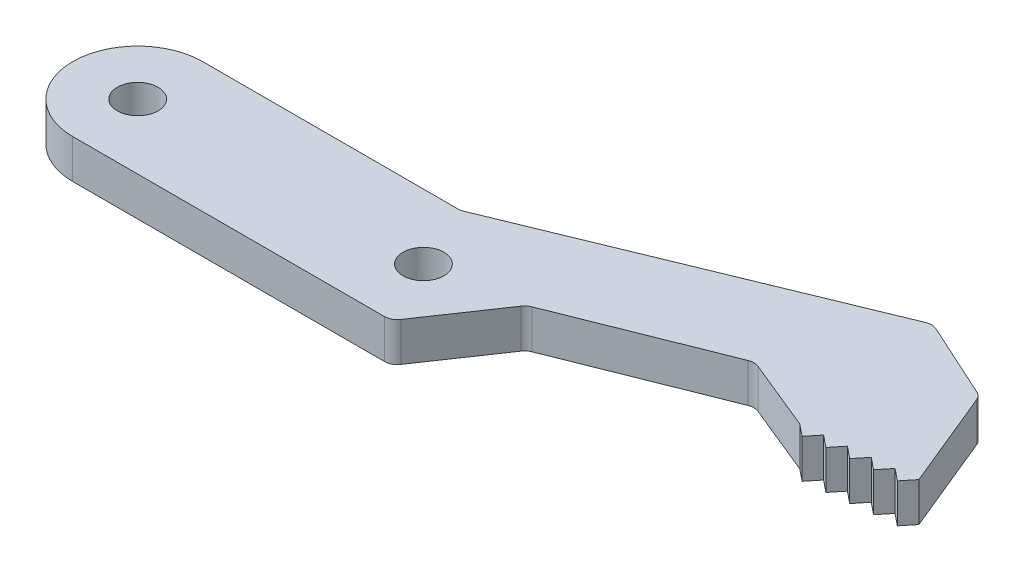
ISO-10303-21;
HEADER;
FILE_DESCRIPTION(('STEP AP214'),'2;1');
FILE_NAME('part.step','',(''),(''),'','','');
FILE_SCHEMA(('AUTOMOTIVE_DESIGN { 1 0 10303 214 1 1 1 1 }'));
ENDSEC;
DATA;
#1=APPLICATION_CONTEXT('core data for automotive mechanical design processes');
#2=APPLICATION_PROTOCOL_DEFINITION('international standard','automotive_design',2000,#1);
#3=PRODUCT_CONTEXT('',#1,'mechanical');
#4=PRODUCT('Part','Part','',(#3));
#5=PRODUCT_RELATED_PRODUCT_CATEGORY('part','',(#4));
#6=PRODUCT_DEFINITION_FORMATION('','',#4);
#7=PRODUCT_DEFINITION_CONTEXT('part definition',#1,'design');
#8=PRODUCT_DEFINITION('design','',#6,#7);
#9=PRODUCT_DEFINITION_SHAPE('','',#8);
#10=(LENGTH_UNIT() NAMED_UNIT(*) SI_UNIT(.MILLI.,.METRE.));
#11=(NAMED_UNIT(*) PLANE_ANGLE_UNIT() SI_UNIT($,.RADIAN.));
#12=(NAMED_UNIT(*) SI_UNIT($,.STERADIAN.) SOLID_ANGLE_UNIT());
#13=UNCERTAINTY_MEASURE_WITH_UNIT(LENGTH_MEASURE(1.E-05),#10,'distance_accuracy_value','');
#14=(GEOMETRIC_REPRESENTATION_CONTEXT(3) GLOBAL_UNCERTAINTY_ASSIGNED_CONTEXT((#13)) GLOBAL_UNIT_ASSIGNED_CONTEXT((#10,
#11,#12)) REPRESENTATION_CONTEXT('',''));
#15=CARTESIAN_POINT('',(0.,0.,0.));
#16=DIRECTION('',(0.,0.,1.));
#17=DIRECTION('',(1.,0.,0.));
#18=AXIS2_PLACEMENT_3D('',#15,#16,#17);
#19=CARTESIAN_POINT('',(34.139900230427,4.5,2.90640588981149));
#20=DIRECTION('',(0.,-1.,0.));
#21=DIRECTION('',(0.,0.,-1.));
#22=AXIS2_PLACEMENT_3D('',#19,#20,#21);
#23=PLANE('',#22);
#24=CARTESIAN_POINT('',(34.139900230427,4.5,2.90640588981149));
#25=DIRECTION('',(0.,-1.,0.));
#26=DIRECTION('',(0.,0.,-1.));
#27=AXIS2_PLACEMENT_3D('',#24,#25,#26);
#28=CIRCLE('',#27,2.);
#29=CARTESIAN_POINT('',(32.4843668879548,4.5,1.78426091167234));
#30=VERTEX_POINT('',#29);
#31=CARTESIAN_POINT('',(33.3991095823899,4.5,1.04865746341441));
#32=VERTEX_POINT('',#31);
#33=EDGE_CURVE('E283',#30,#32,#28,.T.);
#34=ORIENTED_EDGE('',*,*,#33,.T.);
#35=DIRECTION('',(0.92887421319854,0.,-0.370395324018532));
#36=VECTOR('',#35,1.);
#37=CARTESIAN_POINT('',(33.3991095823899,4.5,1.04865746341441));
#38=LINE('',#37,#36);
#39=CARTESIAN_POINT('',(57.2135906693667,4.5,-8.44753945238757));
#40=VERTEX_POINT('',#39);
#41=EDGE_CURVE('E146',#32,#40,#38,.T.);
#42=ORIENTED_EDGE('',*,*,#41,.T.);
#43=CARTESIAN_POINT('',(57.9543813174038,4.5,-6.58979102599049));
#44=DIRECTION('',(0.,-1.,0.));
#45=DIRECTION('',(0.,0.,-1.));
#46=AXIS2_PLACEMENT_3D('',#43,#44,#45);
#47=CIRCLE('',#46,2.);
#48=CARTESIAN_POINT('',(58.7120016151558,4.5,-8.4407398325311));
#49=VERTEX_POINT('',#48);
#50=EDGE_CURVE('E349',#40,#49,#47,.T.);
#51=ORIENTED_EDGE('',*,*,#50,.T.);
#52=DIRECTION('',(0.925474403270305,0.,0.378810148876022));
#53=VECTOR('',#52,1.);
#54=CARTESIAN_POINT('',(58.7120016151558,4.5,-8.4407398325311));
#55=LINE('',#54,#53);
#56=CARTESIAN_POINT('',(69.6436567239064,4.5,-3.96625422323257));
#57=VERTEX_POINT('',#56);
#58=EDGE_CURVE('E368',#49,#57,#55,.T.);
#59=ORIENTED_EDGE('',*,*,#58,.T.);
#60=DIRECTION('',(0.777249081254573,0.,0.629193027368329));
#61=VECTOR('',#60,1.);
#62=CARTESIAN_POINT('',(69.6436567239064,4.5,-3.96625422323257));
#63=LINE('',#62,#61);
#64=CARTESIAN_POINT('',(71.4779645556672,4.5,-2.48135867864334));
#65=VERTEX_POINT('',#64);
#66=EDGE_CURVE('E365',#57,#65,#63,.T.);
#67=ORIENTED_EDGE('',*,*,#66,.T.);
#68=DIRECTION('',(0.629193027368274,0.,-0.777249081254617));
#69=VECTOR('',#68,1.);
#70=CARTESIAN_POINT('',(71.4779645556672,4.5,-2.48135867864334));
#71=LINE('',#70,#69);
#72=CARTESIAN_POINT('',(72.9628601002563,4.5,-4.31566651040423));
#73=VERTEX_POINT('',#72);
#74=EDGE_CURVE('E367',#65,#73,#71,.T.);
#75=ORIENTED_EDGE('',*,*,#74,.T.);
#76=DIRECTION('',(0.777249081254579,0.,0.62919302736832));
#77=VECTOR('',#76,1.);
#78=CARTESIAN_POINT('',(72.9628601002563,4.5,-4.31566651040423));
#79=LINE('',#78,#77);
#80=CARTESIAN_POINT('',(74.7971679320171,4.5,-2.83077096581498));
#81=VERTEX_POINT('',#80);
#82=EDGE_CURVE('E370',#73,#81,#79,.T.);
#83=ORIENTED_EDGE('',*,*,#82,.T.);
#84=DIRECTION('',(0.629193027368325,0.,-0.777249081254575));
#85=VECTOR('',#84,1.);
#86=CARTESIAN_POINT('',(74.7971679320171,4.5,-2.83077096581498));
#87=LINE('',#86,#85);
#88=CARTESIAN_POINT('',(76.2820634766064,4.5,-4.66507879757578));
#89=VERTEX_POINT('',#88);
#90=EDGE_CURVE('E376',#81,#89,#87,.T.);
#91=ORIENTED_EDGE('',*,*,#90,.T.);
#92=DIRECTION('',(0.777249081254577,0.,0.629193027368323));
#93=VECTOR('',#92,1.);
#94=CARTESIAN_POINT('',(76.2820634766064,4.5,-4.66507879757578));
#95=LINE('',#94,#93);
#96=CARTESIAN_POINT('',(78.1163713083671,4.5,-3.18018325298653));
#97=VERTEX_POINT('',#96);
#98=EDGE_CURVE('E378',#89,#97,#95,.T.);
#99=ORIENTED_EDGE('',*,*,#98,.T.);
#100=DIRECTION('',(0.629193027368326,0.,-0.777249081254575));
#101=VECTOR('',#100,1.);
#102=CARTESIAN_POINT('',(78.1163713083671,4.5,-3.18018325298653));
#103=LINE('',#102,#101);
#104=CARTESIAN_POINT('',(79.6012668529564,4.5,-5.01449108474733));
#105=VERTEX_POINT('',#104);
#106=EDGE_CURVE('E380',#97,#105,#103,.T.);
#107=ORIENTED_EDGE('',*,*,#106,.T.);
#108=DIRECTION('',(0.777249081254583,0.,0.629193027368317));
#109=VECTOR('',#108,1.);
#110=CARTESIAN_POINT('',(79.6012668529564,4.5,-5.01449108474733));
#111=LINE('',#110,#109);
#112=CARTESIAN_POINT('',(81.4355746847172,4.5,-3.5295955401581));
#113=VERTEX_POINT('',#112);
#114=EDGE_CURVE('E382',#105,#113,#111,.T.);
#115=ORIENTED_EDGE('',*,*,#114,.T.);
#116=DIRECTION('',(0.629193027368326,0.,-0.777249081254575));
#117=VECTOR('',#116,1.);
#118=CARTESIAN_POINT('',(81.4355746847172,4.5,-3.5295955401581));
#119=LINE('',#118,#117);
#120=CARTESIAN_POINT('',(82.9204702293065,4.5,-5.3639033719189));
#121=VERTEX_POINT('',#120);
#122=EDGE_CURVE('E384',#113,#121,#119,.T.);
#123=ORIENTED_EDGE('',*,*,#122,.T.);
#124=DIRECTION('',(0.777249081254587,0.,0.629193027368311));
#125=VECTOR('',#124,1.);
#126=CARTESIAN_POINT('',(82.9204702293065,4.5,-5.3639033719189));
#127=LINE('',#126,#125);
#128=CARTESIAN_POINT('',(84.7547780610673,4.5,-3.87900782732968));
#129=VERTEX_POINT('',#128);
#130=EDGE_CURVE('E386',#121,#129,#127,.T.);
#131=ORIENTED_EDGE('',*,*,#130,.T.);
#132=DIRECTION('',(0.629193027368273,0.,-0.777249081254618));
#133=VECTOR('',#132,1.);
#134=CARTESIAN_POINT('',(84.7547780610673,4.5,-3.87900782732968));
#135=LINE('',#134,#133);
#136=CARTESIAN_POINT('',(86.2396736056564,4.5,-5.71331565909054));
#137=VERTEX_POINT('',#136);
#138=EDGE_CURVE('E388',#129,#137,#135,.T.);
#139=ORIENTED_EDGE('',*,*,#138,.T.);
#140=DIRECTION('',(-0.380263412733204,0.,-0.92487822816655));
#141=VECTOR('',#140,1.);
#142=CARTESIAN_POINT('',(80.0379760726159,4.5,-20.7971097710621));
#143=LINE('',#142,#141);
#144=CARTESIAN_POINT('',(80.0379760726159,4.5,-20.7971097710621));
#145=VERTEX_POINT('',#144);
#146=EDGE_CURVE('E390',#137,#145,#143,.T.);
#147=ORIENTED_EDGE('',*,*,#146,.T.);
#148=CARTESIAN_POINT('',(78.1882196162828,4.5,-20.0365829455957));
#149=DIRECTION('',(0.,1.,0.));
#150=DIRECTION('',(0.,0.,-1.));
#151=AXIS2_PLACEMENT_3D('',#148,#149,#150);
#152=CIRCLE('',#151,2.);
#153=CARTESIAN_POINT('',(79.0172884525598,4.5,-21.8566502148785));
#154=VERTEX_POINT('',#153);
#155=EDGE_CURVE('E392',#145,#154,#152,.T.);
#156=ORIENTED_EDGE('',*,*,#155,.T.);
#157=DIRECTION('',(-0.910033634641374,0.,-0.414534418138482));
#158=VECTOR('',#157,1.);
#159=CARTESIAN_POINT('',(67.4028520849976,4.5,-27.1472059024506));
#160=LINE('',#159,#158);
#161=CARTESIAN_POINT('',(67.4028520849976,4.5,-27.1472059024506));
#162=VERTEX_POINT('',#161);
#163=EDGE_CURVE('E394',#154,#162,#160,.T.);
#164=ORIENTED_EDGE('',*,*,#163,.T.);
#165=CARTESIAN_POINT('',(66.5737832487207,4.5,-25.3271386331678));
#166=DIRECTION('',(0.,1.,0.));
#167=DIRECTION('',(0.,0.,-1.));
#168=AXIS2_PLACEMENT_3D('',#165,#166,#167);
#169=CIRCLE('',#168,2.);
#170=CARTESIAN_POINT('',(65.8132564232542,4.5,-27.1768950895009));
#171=VERTEX_POINT('',#170);
#172=EDGE_CURVE('E396',#162,#171,#169,.T.);
#173=ORIENTED_EDGE('',*,*,#172,.T.);
#174=DIRECTION('',(-0.924878228166549,0.,0.380263412733207));
#175=VECTOR('',#174,1.);
#176=CARTESIAN_POINT('',(15.4199071979664,4.5,-6.45768430923213));
#177=LINE('',#176,#175);
#178=CARTESIAN_POINT('',(15.4199071979664,4.5,-6.45768430923213));
#179=VERTEX_POINT('',#178);
#180=EDGE_CURVE('E398',#171,#179,#177,.T.);
#181=ORIENTED_EDGE('',*,*,#180,.T.);
#182=CARTESIAN_POINT('',(14.6593803725,4.5,-8.30744076556523));
#183=DIRECTION('',(0.,-1.,0.));
#184=DIRECTION('',(0.,0.,1.));
#185=AXIS2_PLACEMENT_3D('',#182,#183,#184);
#186=CIRCLE('',#185,2.);
#187=CARTESIAN_POINT('',(14.6593803725,4.5,-6.30744076556523));
#188=VERTEX_POINT('',#187);
#189=EDGE_CURVE('E400',#179,#188,#186,.T.);
#190=ORIENTED_EDGE('',*,*,#189,.T.);
#191=DIRECTION('',(-1.,0.,0.));
#192=VECTOR('',#191,1.);
#193=CARTESIAN_POINT('',(-24.64551576361,4.5,-6.30744076556523));
#194=LINE('',#193,#192);
#195=CARTESIAN_POINT('',(-24.64551576361,4.5,-6.30744076556523));
#196=VERTEX_POINT('',#195);
#197=EDGE_CURVE('E402',#188,#196,#194,.T.);
#198=ORIENTED_EDGE('',*,*,#197,.T.);
#199=CARTESIAN_POINT('',(-24.64551576361,4.5,3.69255923443477));
#200=DIRECTION('',(0.,1.,0.));
#201=DIRECTION('',(0.,0.,1.));
#202=AXIS2_PLACEMENT_3D('',#199,#200,#201);
#203=CIRCLE('',#202,10.);
#204=CARTESIAN_POINT('',(-24.64551576361,4.5,13.6925592344348));
#205=VERTEX_POINT('',#204);
#206=EDGE_CURVE('E216',#196,#205,#203,.T.);
#207=ORIENTED_EDGE('',*,*,#206,.T.);
#208=DIRECTION('',(1.,0.,0.));
#209=VECTOR('',#208,1.);
#210=CARTESIAN_POINT('',(-24.64551576361,4.5,13.6925592344348));
#211=LINE('',#210,#209);
#212=CARTESIAN_POINT('',(23.352235980693,4.5,13.6925592344348));
#213=VERTEX_POINT('',#212);
#214=EDGE_CURVE('E210',#205,#213,#211,.T.);
#215=ORIENTED_EDGE('',*,*,#214,.T.);
#216=CARTESIAN_POINT('',(23.352235980693,4.5,11.6925592344348));
#217=DIRECTION('',(0.,1.,0.));
#218=DIRECTION('',(0.,0.,1.));
#219=AXIS2_PLACEMENT_3D('',#216,#217,#218);
#220=CIRCLE('',#219,2.);
#221=CARTESIAN_POINT('',(25.0077693231652,4.5,12.8147042125739));
#222=VERTEX_POINT('',#221);
#223=EDGE_CURVE('E214',#213,#222,#220,.T.);
#224=ORIENTED_EDGE('',*,*,#223,.T.);
#225=DIRECTION('',(0.561072489069578,0.,-0.827766671236085));
#226=VECTOR('',#225,1.);
#227=CARTESIAN_POINT('',(25.0077693231652,4.5,12.8147042125739));
#228=LINE('',#227,#226);
#229=EDGE_CURVE('E52',#222,#30,#228,.T.);
#230=ORIENTED_EDGE('',*,*,#229,.T.);
#231=EDGE_LOOP('',(#34,#42,#51,#59,#67,#75,#83,#91,#99,#107,#115,#123,#131,#139,#147,#156,#164,
#173,#181,#190,#198,#207,#215,#224,#230));
#232=FACE_BOUND('',#231,.T.);
#233=CARTESIAN_POINT('',(-24.64551576361,4.5,3.69255923443477));
#234=DIRECTION('',(0.,1.,0.));
#235=DIRECTION('',(0.,0.,1.));
#236=AXIS2_PLACEMENT_3D('',#233,#234,#235);
#237=CIRCLE('',#236,3.15);
#238=CARTESIAN_POINT('',(-24.64551576361,4.5,6.84255923443477));
#239=VERTEX_POINT('',#238);
#240=EDGE_CURVE('E238',#239,#239,#237,.T.);
#241=ORIENTED_EDGE('',*,*,#240,.F.);
#242=EDGE_LOOP('',(#241));
#243=FACE_BOUND('',#242,.T.);
#244=CARTESIAN_POINT('',(19.35448423639,4.5,3.69255923443477));
#245=DIRECTION('',(0.,1.,0.));
#246=DIRECTION('',(0.,0.,1.));
#247=AXIS2_PLACEMENT_3D('',#244,#245,#246);
#248=CIRCLE('',#247,3.15);
#249=CARTESIAN_POINT('',(19.35448423639,4.5,6.84255923443477));
#250=VERTEX_POINT('',#249);
#251=EDGE_CURVE('E443',#250,#250,#248,.T.);
#252=ORIENTED_EDGE('',*,*,#251,.F.);
#253=EDGE_LOOP('',(#252));
#254=FACE_BOUND('',#253,.T.);
#255=ADVANCED_FACE('F35',(#232,#243,#254),#23,.F.);
#256=CARTESIAN_POINT('',(34.139900230427,-1.5,2.90640588981149));
#257=DIRECTION('',(0.,-1.,0.));
#258=DIRECTION('',(0.,0.,-1.));
#259=AXIS2_PLACEMENT_3D('',#256,#257,#258);
#260=PLANE('',#259);
#261=CARTESIAN_POINT('',(-24.64551576361,-1.5,3.69255923443477));
#262=DIRECTION('',(0.,1.,0.));
#263=DIRECTION('',(0.,0.,1.));
#264=AXIS2_PLACEMENT_3D('',#261,#262,#263);
#265=CIRCLE('',#264,3.15);
#266=CARTESIAN_POINT('',(-24.64551576361,-1.5,6.84255923443477));
#267=VERTEX_POINT('',#266);
#268=EDGE_CURVE('E448',#267,#267,#265,.T.);
#269=ORIENTED_EDGE('',*,*,#268,.T.);
#270=EDGE_LOOP('',(#269));
#271=FACE_BOUND('',#270,.T.);
#272=CARTESIAN_POINT('',(34.139900230427,-1.5,2.90640588981149));
#273=DIRECTION('',(0.,-1.,0.));
#274=DIRECTION('',(0.,0.,-1.));
#275=AXIS2_PLACEMENT_3D('',#272,#273,#274);
#276=CIRCLE('',#275,2.);
#277=CARTESIAN_POINT('',(32.4843668879548,-1.5,1.78426091167234));
#278=VERTEX_POINT('',#277);
#279=CARTESIAN_POINT('',(33.3991095823899,-1.5,1.04865746341441));
#280=VERTEX_POINT('',#279);
#281=EDGE_CURVE('E234',#278,#280,#276,.T.);
#282=ORIENTED_EDGE('',*,*,#281,.F.);
#283=DIRECTION('',(0.561072489069578,0.,-0.827766671236085));
#284=VECTOR('',#283,1.);
#285=CARTESIAN_POINT('',(25.0077693231652,-1.5,12.8147042125739));
#286=LINE('',#285,#284);
#287=CARTESIAN_POINT('',(25.0077693231652,-1.5,12.8147042125739));
#288=VERTEX_POINT('',#287);
#289=EDGE_CURVE('E138',#288,#278,#286,.T.);
#290=ORIENTED_EDGE('',*,*,#289,.F.);
#291=CARTESIAN_POINT('',(23.352235980693,-1.5,11.6925592344348));
#292=DIRECTION('',(0.,1.,0.));
#293=DIRECTION('',(0.,0.,1.));
#294=AXIS2_PLACEMENT_3D('',#291,#292,#293);
#295=CIRCLE('',#294,2.);
#296=CARTESIAN_POINT('',(23.352235980693,-1.5,13.6925592344348));
#297=VERTEX_POINT('',#296);
#298=EDGE_CURVE('E132',#297,#288,#295,.T.);
#299=ORIENTED_EDGE('',*,*,#298,.F.);
#300=DIRECTION('',(1.,0.,0.));
#301=VECTOR('',#300,1.);
#302=CARTESIAN_POINT('',(-24.64551576361,-1.5,13.6925592344348));
#303=LINE('',#302,#301);
#304=CARTESIAN_POINT('',(-24.64551576361,-1.5,13.6925592344348));
#305=VERTEX_POINT('',#304);
#306=EDGE_CURVE('E224',#305,#297,#303,.T.);
#307=ORIENTED_EDGE('',*,*,#306,.F.);
#308=CARTESIAN_POINT('',(-24.64551576361,-1.5,3.69255923443477));
#309=DIRECTION('',(0.,1.,0.));
#310=DIRECTION('',(0.,0.,1.));
#311=AXIS2_PLACEMENT_3D('',#308,#309,#310);
#312=CIRCLE('',#311,10.);
#313=CARTESIAN_POINT('',(-24.64551576361,-1.5,-6.30744076556523));
#314=VERTEX_POINT('',#313);
#315=EDGE_CURVE('E278',#314,#305,#312,.T.);
#316=ORIENTED_EDGE('',*,*,#315,.F.);
#317=DIRECTION('',(-1.,0.,0.));
#318=VECTOR('',#317,1.);
#319=CARTESIAN_POINT('',(-24.64551576361,-1.5,-6.30744076556523));
#320=LINE('',#319,#318);
#321=CARTESIAN_POINT('',(14.6593803725,-1.5,-6.30744076556523));
#322=VERTEX_POINT('',#321);
#323=EDGE_CURVE('E276',#322,#314,#320,.T.);
#324=ORIENTED_EDGE('',*,*,#323,.F.);
#325=CARTESIAN_POINT('',(14.6593803725,-1.5,-8.30744076556523));
#326=DIRECTION('',(0.,-1.,0.));
#327=DIRECTION('',(0.,0.,1.));
#328=AXIS2_PLACEMENT_3D('',#325,#326,#327);
#329=CIRCLE('',#328,2.);
#330=CARTESIAN_POINT('',(15.4199071979664,-1.5,-6.45768430923213));
#331=VERTEX_POINT('',#330);
#332=EDGE_CURVE('E274',#331,#322,#329,.T.);
#333=ORIENTED_EDGE('',*,*,#332,.F.);
#334=DIRECTION('',(-0.924878228166549,0.,0.380263412733207));
#335=VECTOR('',#334,1.);
#336=CARTESIAN_POINT('',(15.4199071979664,-1.5,-6.45768430923213));
#337=LINE('',#336,#335);
#338=CARTESIAN_POINT('',(65.8132564232542,-1.5,-27.1768950895009));
#339=VERTEX_POINT('',#338);
#340=EDGE_CURVE('E272',#339,#331,#337,.T.);
#341=ORIENTED_EDGE('',*,*,#340,.F.);
#342=CARTESIAN_POINT('',(66.5737832487207,-1.5,-25.3271386331678));
#343=DIRECTION('',(0.,1.,0.));
#344=DIRECTION('',(0.,0.,-1.));
#345=AXIS2_PLACEMENT_3D('',#342,#343,#344);
#346=CIRCLE('',#345,2.);
#347=CARTESIAN_POINT('',(67.4028520849976,-1.5,-27.1472059024506));
#348=VERTEX_POINT('',#347);
#349=EDGE_CURVE('E270',#348,#339,#346,.T.);
#350=ORIENTED_EDGE('',*,*,#349,.F.);
#351=DIRECTION('',(-0.910033634641374,0.,-0.414534418138482));
#352=VECTOR('',#351,1.);
#353=CARTESIAN_POINT('',(67.4028520849976,-1.5,-27.1472059024506));
#354=LINE('',#353,#352);
#355=CARTESIAN_POINT('',(79.0172884525598,-1.5,-21.8566502148785));
#356=VERTEX_POINT('',#355);
#357=EDGE_CURVE('E268',#356,#348,#354,.T.);
#358=ORIENTED_EDGE('',*,*,#357,.F.);
#359=CARTESIAN_POINT('',(78.1882196162828,-1.5,-20.0365829455957));
#360=DIRECTION('',(0.,1.,0.));
#361=DIRECTION('',(0.,0.,-1.));
#362=AXIS2_PLACEMENT_3D('',#359,#360,#361);
#363=CIRCLE('',#362,2.);
#364=CARTESIAN_POINT('',(80.0379760726159,-1.5,-20.7971097710621));
#365=VERTEX_POINT('',#364);
#366=EDGE_CURVE('E266',#365,#356,#363,.T.);
#367=ORIENTED_EDGE('',*,*,#366,.F.);
#368=DIRECTION('',(-0.380263412733204,0.,-0.92487822816655));
#369=VECTOR('',#368,1.);
#370=CARTESIAN_POINT('',(80.0379760726159,-1.5,-20.7971097710621));
#371=LINE('',#370,#369);
#372=CARTESIAN_POINT('',(86.2396736056564,-1.5,-5.71331565909054));
#373=VERTEX_POINT('',#372);
#374=EDGE_CURVE('E264',#373,#365,#371,.T.);
#375=ORIENTED_EDGE('',*,*,#374,.F.);
#376=DIRECTION('',(0.629193027368273,0.,-0.777249081254618));
#377=VECTOR('',#376,1.);
#378=CARTESIAN_POINT('',(84.7547780610673,-1.5,-3.87900782732968));
#379=LINE('',#378,#377);
#380=CARTESIAN_POINT('',(84.7547780610673,-1.5,-3.87900782732968));
#381=VERTEX_POINT('',#380);
#382=EDGE_CURVE('E262',#381,#373,#379,.T.);
#383=ORIENTED_EDGE('',*,*,#382,.F.);
#384=DIRECTION('',(0.777249081254587,0.,0.629193027368311));
#385=VECTOR('',#384,1.);
#386=CARTESIAN_POINT('',(82.9204702293065,-1.5,-5.3639033719189));
#387=LINE('',#386,#385);
#388=CARTESIAN_POINT('',(82.9204702293065,-1.5,-5.3639033719189));
#389=VERTEX_POINT('',#388);
#390=EDGE_CURVE('E260',#389,#381,#387,.T.);
#391=ORIENTED_EDGE('',*,*,#390,.F.);
#392=DIRECTION('',(0.629193027368326,0.,-0.777249081254575));
#393=VECTOR('',#392,1.);
#394=CARTESIAN_POINT('',(81.4355746847172,-1.5,-3.5295955401581));
#395=LINE('',#394,#393);
#396=CARTESIAN_POINT('',(81.4355746847172,-1.5,-3.5295955401581));
#397=VERTEX_POINT('',#396);
#398=EDGE_CURVE('E258',#397,#389,#395,.T.);
#399=ORIENTED_EDGE('',*,*,#398,.F.);
#400=DIRECTION('',(0.777249081254583,0.,0.629193027368317));
#401=VECTOR('',#400,1.);
#402=CARTESIAN_POINT('',(79.6012668529564,-1.5,-5.01449108474733));
#403=LINE('',#402,#401);
#404=CARTESIAN_POINT('',(79.6012668529564,-1.5,-5.01449108474733));
#405=VERTEX_POINT('',#404);
#406=EDGE_CURVE('E256',#405,#397,#403,.T.);
#407=ORIENTED_EDGE('',*,*,#406,.F.);
#408=DIRECTION('',(0.629193027368326,0.,-0.777249081254575));
#409=VECTOR('',#408,1.);
#410=CARTESIAN_POINT('',(78.1163713083671,-1.5,-3.18018325298653));
#411=LINE('',#410,#409);
#412=CARTESIAN_POINT('',(78.1163713083671,-1.5,-3.18018325298653));
#413=VERTEX_POINT('',#412);
#414=EDGE_CURVE('E254',#413,#405,#411,.T.);
#415=ORIENTED_EDGE('',*,*,#414,.F.);
#416=DIRECTION('',(0.777249081254577,0.,0.629193027368323));
#417=VECTOR('',#416,1.);
#418=CARTESIAN_POINT('',(76.2820634766064,-1.5,-4.66507879757578));
#419=LINE('',#418,#417);
#420=CARTESIAN_POINT('',(76.2820634766064,-1.5,-4.66507879757578));
#421=VERTEX_POINT('',#420);
#422=EDGE_CURVE('E252',#421,#413,#419,.T.);
#423=ORIENTED_EDGE('',*,*,#422,.F.);
#424=DIRECTION('',(0.629193027368325,0.,-0.777249081254575));
#425=VECTOR('',#424,1.);
#426=CARTESIAN_POINT('',(74.7971679320171,-1.5,-2.83077096581498));
#427=LINE('',#426,#425);
#428=CARTESIAN_POINT('',(74.7971679320171,-1.5,-2.83077096581498));
#429=VERTEX_POINT('',#428);
#430=EDGE_CURVE('E250',#429,#421,#427,.T.);
#431=ORIENTED_EDGE('',*,*,#430,.F.);
#432=DIRECTION('',(0.777249081254579,0.,0.62919302736832));
#433=VECTOR('',#432,1.);
#434=CARTESIAN_POINT('',(72.9628601002563,-1.5,-4.31566651040423));
#435=LINE('',#434,#433);
#436=CARTESIAN_POINT('',(72.9628601002563,-1.5,-4.31566651040423));
#437=VERTEX_POINT('',#436);
#438=EDGE_CURVE('E248',#437,#429,#435,.T.);
#439=ORIENTED_EDGE('',*,*,#438,.F.);
#440=DIRECTION('',(0.629193027368274,0.,-0.777249081254617));
#441=VECTOR('',#440,1.);
#442=CARTESIAN_POINT('',(71.4779645556672,-1.5,-2.48135867864334));
#443=LINE('',#442,#441);
#444=CARTESIAN_POINT('',(71.4779645556672,-1.5,-2.48135867864334));
#445=VERTEX_POINT('',#444);
#446=EDGE_CURVE('E246',#445,#437,#443,.T.);
#447=ORIENTED_EDGE('',*,*,#446,.F.);
#448=DIRECTION('',(0.777249081254573,0.,0.629193027368329));
#449=VECTOR('',#448,1.);
#450=CARTESIAN_POINT('',(69.6436567239064,-1.5,-3.96625422323257));
#451=LINE('',#450,#449);
#452=CARTESIAN_POINT('',(69.6436567239064,-1.5,-3.96625422323257));
#453=VERTEX_POINT('',#452);
#454=EDGE_CURVE('E244',#453,#445,#451,.T.);
#455=ORIENTED_EDGE('',*,*,#454,.F.);
#456=DIRECTION('',(0.925474403270305,0.,0.378810148876022));
#457=VECTOR('',#456,1.);
#458=CARTESIAN_POINT('',(58.7120016151558,-1.5,-8.4407398325311));
#459=LINE('',#458,#457);
#460=CARTESIAN_POINT('',(58.7120016151558,-1.5,-8.4407398325311));
#461=VERTEX_POINT('',#460);
#462=EDGE_CURVE('E242',#461,#453,#459,.T.);
#463=ORIENTED_EDGE('',*,*,#462,.F.);
#464=CARTESIAN_POINT('',(57.9543813174038,-1.5,-6.58979102599049));
#465=DIRECTION('',(0.,-1.,0.));
#466=DIRECTION('',(0.,0.,-1.));
#467=AXIS2_PLACEMENT_3D('',#464,#465,#466);
#468=CIRCLE('',#467,2.);
#469=CARTESIAN_POINT('',(57.2135906693667,-1.5,-8.44753945238757));
#470=VERTEX_POINT('',#469);
#471=EDGE_CURVE('E240',#470,#461,#468,.T.);
#472=ORIENTED_EDGE('',*,*,#471,.F.);
#473=DIRECTION('',(0.92887421319854,0.,-0.370395324018532));
#474=VECTOR('',#473,1.);
#475=CARTESIAN_POINT('',(33.3991095823899,-1.5,1.04865746341441));
#476=LINE('',#475,#474);
#477=EDGE_CURVE('E237',#280,#470,#476,.T.);
#478=ORIENTED_EDGE('',*,*,#477,.F.);
#479=EDGE_LOOP('',(#282,#290,#299,#307,#316,#324,#333,#341,#350,#358,#367,#375,#383,#391,#399,
#407,#415,#423,#431,#439,#447,#455,#463,#472,#478));
#480=FACE_BOUND('',#479,.T.);
#481=CARTESIAN_POINT('',(19.35448423639,-1.5,3.69255923443477));
#482=DIRECTION('',(0.,1.,0.));
#483=DIRECTION('',(0.,0.,1.));
#484=AXIS2_PLACEMENT_3D('',#481,#482,#483);
#485=CIRCLE('',#484,3.15);
#486=CARTESIAN_POINT('',(19.35448423639,-1.5,6.84255923443477));
#487=VERTEX_POINT('',#486);
#488=EDGE_CURVE('E446',#487,#487,#485,.T.);
#489=ORIENTED_EDGE('',*,*,#488,.T.);
#490=EDGE_LOOP('',(#489));
#491=FACE_BOUND('',#490,.T.);
#492=ADVANCED_FACE('F353',(#271,#480,#491),#260,.T.);
#493=CARTESIAN_POINT('',(34.139900230427,4.5,2.90640588981149));
#494=DIRECTION('',(0.,-1.,0.));
#495=DIRECTION('',(0.,0.,-1.));
#496=AXIS2_PLACEMENT_3D('',#493,#494,#495);
#497=CYLINDRICAL_SURFACE('',#496,2.);
#498=ORIENTED_EDGE('',*,*,#281,.T.);
#499=DIRECTION('',(0.,-1.,0.));
#500=VECTOR('',#499,1.);
#501=CARTESIAN_POINT('',(33.3991095823899,4.5,1.04865746341441));
#502=LINE('',#501,#500);
#503=EDGE_CURVE('E11',#32,#280,#502,.T.);
#504=ORIENTED_EDGE('',*,*,#503,.F.);
#505=ORIENTED_EDGE('',*,*,#33,.F.);
#506=DIRECTION('',(0.,-1.,0.));
#507=VECTOR('',#506,1.);
#508=CARTESIAN_POINT('',(32.4843668879548,4.5,1.78426091167234));
#509=LINE('',#508,#507);
#510=EDGE_CURVE('E230',#30,#278,#509,.T.);
#511=ORIENTED_EDGE('',*,*,#510,.T.);
#512=EDGE_LOOP('',(#498,#504,#505,#511));
#513=FACE_BOUND('',#512,.T.);
#514=ADVANCED_FACE('F37',(#513),#497,.F.);
#515=CARTESIAN_POINT('',(33.3991095823899,4.5,1.04865746341441));
#516=DIRECTION('',(-0.370395324018532,0.,-0.92887421319854));
#517=DIRECTION('',(-0.92887421319854,0.,0.370395324018532));
#518=AXIS2_PLACEMENT_3D('',#515,#516,#517);
#519=PLANE('',#518);
#520=ORIENTED_EDGE('',*,*,#477,.T.);
#521=DIRECTION('',(0.,-1.,0.));
#522=VECTOR('',#521,1.);
#523=CARTESIAN_POINT('',(57.2135906693667,4.5,-8.44753945238757));
#524=LINE('',#523,#522);
#525=EDGE_CURVE('E44',#40,#470,#524,.T.);
#526=ORIENTED_EDGE('',*,*,#525,.F.);
#527=ORIENTED_EDGE('',*,*,#41,.F.);
#528=ORIENTED_EDGE('',*,*,#503,.T.);
#529=EDGE_LOOP('',(#520,#526,#527,#528));
#530=FACE_BOUND('',#529,.T.);
#531=ADVANCED_FACE('F673',(#530),#519,.F.);
#532=CARTESIAN_POINT('',(57.9543813174038,4.5,-6.58979102599049));
#533=DIRECTION('',(0.,-1.,0.));
#534=DIRECTION('',(0.,0.,-1.));
#535=AXIS2_PLACEMENT_3D('',#532,#533,#534);
#536=CYLINDRICAL_SURFACE('',#535,2.);
#537=ORIENTED_EDGE('',*,*,#471,.T.);
#538=DIRECTION('',(0.,-1.,0.));
#539=VECTOR('',#538,1.);
#540=CARTESIAN_POINT('',(58.7120016151558,4.5,-8.4407398325311));
#541=LINE('',#540,#539);
#542=EDGE_CURVE('E341',#49,#461,#541,.T.);
#543=ORIENTED_EDGE('',*,*,#542,.F.);
#544=ORIENTED_EDGE('',*,*,#50,.F.);
#545=ORIENTED_EDGE('',*,*,#525,.T.);
#546=EDGE_LOOP('',(#537,#543,#544,#545));
#547=FACE_BOUND('',#546,.T.);
#548=ADVANCED_FACE('F347',(#547),#536,.F.);
#549=CARTESIAN_POINT('',(58.7120016151558,4.5,-8.4407398325311));
#550=DIRECTION('',(0.378810148876022,0.,-0.925474403270305));
#551=DIRECTION('',(-0.925474403270305,0.,-0.378810148876022));
#552=AXIS2_PLACEMENT_3D('',#549,#550,#551);
#553=PLANE('',#552);
#554=ORIENTED_EDGE('',*,*,#462,.T.);
#555=DIRECTION('',(0.,-1.,0.));
#556=VECTOR('',#555,1.);
#557=CARTESIAN_POINT('',(69.6436567239064,4.5,-3.96625422323257));
#558=LINE('',#557,#556);
#559=EDGE_CURVE('E338',#57,#453,#558,.T.);
#560=ORIENTED_EDGE('',*,*,#559,.F.);
#561=ORIENTED_EDGE('',*,*,#58,.F.);
#562=ORIENTED_EDGE('',*,*,#542,.T.);
#563=EDGE_LOOP('',(#554,#560,#561,#562));
#564=FACE_BOUND('',#563,.T.);
#565=ADVANCED_FACE('F359',(#564),#553,.F.);
#566=CARTESIAN_POINT('',(69.6436567239064,4.5,-3.96625422323257));
#567=DIRECTION('',(0.629193027368329,0.,-0.777249081254573));
#568=DIRECTION('',(-0.777249081254573,0.,-0.629193027368329));
#569=AXIS2_PLACEMENT_3D('',#566,#567,#568);
#570=PLANE('',#569);
#571=ORIENTED_EDGE('',*,*,#454,.T.);
#572=DIRECTION('',(0.,-1.,0.));
#573=VECTOR('',#572,1.);
#574=CARTESIAN_POINT('',(71.4779645556672,4.5,-2.48135867864334));
#575=LINE('',#574,#573);
#576=EDGE_CURVE('E335',#65,#445,#575,.T.);
#577=ORIENTED_EDGE('',*,*,#576,.F.);
#578=ORIENTED_EDGE('',*,*,#66,.F.);
#579=ORIENTED_EDGE('',*,*,#559,.T.);
#580=EDGE_LOOP('',(#571,#577,#578,#579));
#581=FACE_BOUND('',#580,.T.);
#582=ADVANCED_FACE('F363',(#581),#570,.F.);
#583=CARTESIAN_POINT('',(71.4779645556672,4.5,-2.48135867864334));
#584=DIRECTION('',(-0.777249081254617,0.,-0.629193027368274));
#585=DIRECTION('',(-0.629193027368274,0.,0.777249081254617));
#586=AXIS2_PLACEMENT_3D('',#583,#584,#585);
#587=PLANE('',#586);
#588=ORIENTED_EDGE('',*,*,#446,.T.);
#589=DIRECTION('',(0.,-1.,0.));
#590=VECTOR('',#589,1.);
#591=CARTESIAN_POINT('',(72.9628601002563,4.5,-4.31566651040423));
#592=LINE('',#591,#590);
#593=EDGE_CURVE('E332',#73,#437,#592,.T.);
#594=ORIENTED_EDGE('',*,*,#593,.F.);
#595=ORIENTED_EDGE('',*,*,#74,.F.);
#596=ORIENTED_EDGE('',*,*,#576,.T.);
#597=EDGE_LOOP('',(#588,#594,#595,#596));
#598=FACE_BOUND('',#597,.T.);
#599=ADVANCED_FACE('F638',(#598),#587,.F.);
#600=CARTESIAN_POINT('',(72.9628601002563,4.5,-4.31566651040423));
#601=DIRECTION('',(0.62919302736832,0.,-0.77724908125458));
#602=DIRECTION('',(-0.77724908125458,0.,-0.62919302736832));
#603=AXIS2_PLACEMENT_3D('',#600,#601,#602);
#604=PLANE('',#603);
#605=ORIENTED_EDGE('',*,*,#438,.T.);
#606=DIRECTION('',(0.,-1.,0.));
#607=VECTOR('',#606,1.);
#608=CARTESIAN_POINT('',(74.7971679320171,4.5,-2.83077096581498));
#609=LINE('',#608,#607);
#610=EDGE_CURVE('E329',#81,#429,#609,.T.);
#611=ORIENTED_EDGE('',*,*,#610,.F.);
#612=ORIENTED_EDGE('',*,*,#82,.F.);
#613=ORIENTED_EDGE('',*,*,#593,.T.);
#614=EDGE_LOOP('',(#605,#611,#612,#613));
#615=FACE_BOUND('',#614,.T.);
#616=ADVANCED_FACE('F628',(#615),#604,.F.);
#617=CARTESIAN_POINT('',(74.7971679320171,4.5,-2.83077096581498));
#618=DIRECTION('',(-0.777249081254575,0.,-0.629193027368325));
#619=DIRECTION('',(-0.629193027368325,0.,0.777249081254576));
#620=AXIS2_PLACEMENT_3D('',#617,#618,#619);
#621=PLANE('',#620);
#622=ORIENTED_EDGE('',*,*,#430,.T.);
#623=DIRECTION('',(0.,-1.,0.));
#624=VECTOR('',#623,1.);
#625=CARTESIAN_POINT('',(76.2820634766064,4.5,-4.66507879757578));
#626=LINE('',#625,#624);
#627=EDGE_CURVE('E326',#89,#421,#626,.T.);
#628=ORIENTED_EDGE('',*,*,#627,.F.);
#629=ORIENTED_EDGE('',*,*,#90,.F.);
#630=ORIENTED_EDGE('',*,*,#610,.T.);
#631=EDGE_LOOP('',(#622,#628,#629,#630));
#632=FACE_BOUND('',#631,.T.);
#633=ADVANCED_FACE('F618',(#632),#621,.F.);
#634=CARTESIAN_POINT('',(76.2820634766064,4.5,-4.66507879757578));
#635=DIRECTION('',(0.629193027368323,0.,-0.777249081254577));
#636=DIRECTION('',(-0.777249081254577,0.,-0.629193027368323));
#637=AXIS2_PLACEMENT_3D('',#634,#635,#636);
#638=PLANE('',#637);
#639=ORIENTED_EDGE('',*,*,#422,.T.);
#640=DIRECTION('',(0.,-1.,0.));
#641=VECTOR('',#640,1.);
#642=CARTESIAN_POINT('',(78.1163713083671,4.5,-3.18018325298653));
#643=LINE('',#642,#641);
#644=EDGE_CURVE('E323',#97,#413,#643,.T.);
#645=ORIENTED_EDGE('',*,*,#644,.F.);
#646=ORIENTED_EDGE('',*,*,#98,.F.);
#647=ORIENTED_EDGE('',*,*,#627,.T.);
#648=EDGE_LOOP('',(#639,#645,#646,#647));
#649=FACE_BOUND('',#648,.T.);
#650=ADVANCED_FACE('F608',(#649),#638,.F.);
#651=CARTESIAN_POINT('',(78.1163713083671,4.5,-3.18018325298653));
#652=DIRECTION('',(-0.777249081254575,0.,-0.629193027368326));
#653=DIRECTION('',(-0.629193027368326,0.,0.777249081254575));
#654=AXIS2_PLACEMENT_3D('',#651,#652,#653);
#655=PLANE('',#654);
#656=ORIENTED_EDGE('',*,*,#414,.T.);
#657=DIRECTION('',(0.,-1.,0.));
#658=VECTOR('',#657,1.);
#659=CARTESIAN_POINT('',(79.6012668529564,4.5,-5.01449108474733));
#660=LINE('',#659,#658);
#661=EDGE_CURVE('E320',#105,#405,#660,.T.);
#662=ORIENTED_EDGE('',*,*,#661,.F.);
#663=ORIENTED_EDGE('',*,*,#106,.F.);
#664=ORIENTED_EDGE('',*,*,#644,.T.);
#665=EDGE_LOOP('',(#656,#662,#663,#664));
#666=FACE_BOUND('',#665,.T.);
#667=ADVANCED_FACE('F598',(#666),#655,.F.);
#668=CARTESIAN_POINT('',(79.6012668529564,4.5,-5.01449108474733));
#669=DIRECTION('',(0.629193027368317,0.,-0.777249081254583));
#670=DIRECTION('',(-0.777249081254583,0.,-0.629193027368317));
#671=AXIS2_PLACEMENT_3D('',#668,#669,#670);
#672=PLANE('',#671);
#673=ORIENTED_EDGE('',*,*,#406,.T.);
#674=DIRECTION('',(0.,-1.,0.));
#675=VECTOR('',#674,1.);
#676=CARTESIAN_POINT('',(81.4355746847172,4.5,-3.5295955401581));
#677=LINE('',#676,#675);
#678=EDGE_CURVE('E317',#113,#397,#677,.T.);
#679=ORIENTED_EDGE('',*,*,#678,.F.);
#680=ORIENTED_EDGE('',*,*,#114,.F.);
#681=ORIENTED_EDGE('',*,*,#661,.T.);
#682=EDGE_LOOP('',(#673,#679,#680,#681));
#683=FACE_BOUND('',#682,.T.);
#684=ADVANCED_FACE('F588',(#683),#672,.F.);
#685=CARTESIAN_POINT('',(81.4355746847172,4.5,-3.5295955401581));
#686=DIRECTION('',(-0.777249081254575,0.,-0.629193027368326));
#687=DIRECTION('',(-0.629193027368326,0.,0.777249081254575));
#688=AXIS2_PLACEMENT_3D('',#685,#686,#687);
#689=PLANE('',#688);
#690=ORIENTED_EDGE('',*,*,#398,.T.);
#691=DIRECTION('',(0.,-1.,0.));
#692=VECTOR('',#691,1.);
#693=CARTESIAN_POINT('',(82.9204702293065,4.5,-5.3639033719189));
#694=LINE('',#693,#692);
#695=EDGE_CURVE('E314',#121,#389,#694,.T.);
#696=ORIENTED_EDGE('',*,*,#695,.F.);
#697=ORIENTED_EDGE('',*,*,#122,.F.);
#698=ORIENTED_EDGE('',*,*,#678,.T.);
#699=EDGE_LOOP('',(#690,#696,#697,#698));
#700=FACE_BOUND('',#699,.T.);
#701=ADVANCED_FACE('F578',(#700),#689,.F.);
#702=CARTESIAN_POINT('',(82.9204702293065,4.5,-5.3639033719189));
#703=DIRECTION('',(0.629193027368311,0.,-0.777249081254587));
#704=DIRECTION('',(-0.777249081254587,0.,-0.629193027368311));
#705=AXIS2_PLACEMENT_3D('',#702,#703,#704);
#706=PLANE('',#705);
#707=ORIENTED_EDGE('',*,*,#390,.T.);
#708=DIRECTION('',(0.,-1.,0.));
#709=VECTOR('',#708,1.);
#710=CARTESIAN_POINT('',(84.7547780610673,4.5,-3.87900782732968));
#711=LINE('',#710,#709);
#712=EDGE_CURVE('E311',#129,#381,#711,.T.);
#713=ORIENTED_EDGE('',*,*,#712,.F.);
#714=ORIENTED_EDGE('',*,*,#130,.F.);
#715=ORIENTED_EDGE('',*,*,#695,.T.);
#716=EDGE_LOOP('',(#707,#713,#714,#715));
#717=FACE_BOUND('',#716,.T.);
#718=ADVANCED_FACE('F568',(#717),#706,.F.);
#719=CARTESIAN_POINT('',(84.7547780610673,4.5,-3.87900782732968));
#720=DIRECTION('',(-0.777249081254618,0.,-0.629193027368273));
#721=DIRECTION('',(-0.629193027368273,0.,0.777249081254618));
#722=AXIS2_PLACEMENT_3D('',#719,#720,#721);
#723=PLANE('',#722);
#724=ORIENTED_EDGE('',*,*,#382,.T.);
#725=DIRECTION('',(0.,-1.,0.));
#726=VECTOR('',#725,1.);
#727=CARTESIAN_POINT('',(86.2396736056564,4.5,-5.71331565909054));
#728=LINE('',#727,#726);
#729=EDGE_CURVE('E308',#137,#373,#728,.T.);
#730=ORIENTED_EDGE('',*,*,#729,.F.);
#731=ORIENTED_EDGE('',*,*,#138,.F.);
#732=ORIENTED_EDGE('',*,*,#712,.T.);
#733=EDGE_LOOP('',(#724,#730,#731,#732));
#734=FACE_BOUND('',#733,.T.);
#735=ADVANCED_FACE('F558',(#734),#723,.F.);
#736=CARTESIAN_POINT('',(80.0379760726159,4.5,-20.7971097710621));
#737=DIRECTION('',(-0.92487822816655,0.,0.380263412733204));
#738=DIRECTION('',(0.380263412733204,0.,0.92487822816655));
#739=AXIS2_PLACEMENT_3D('',#736,#737,#738);
#740=PLANE('',#739);
#741=ORIENTED_EDGE('',*,*,#374,.T.);
#742=DIRECTION('',(0.,-1.,0.));
#743=VECTOR('',#742,1.);
#744=CARTESIAN_POINT('',(80.0379760726159,4.5,-20.7971097710621));
#745=LINE('',#744,#743);
#746=EDGE_CURVE('E305',#145,#365,#745,.T.);
#747=ORIENTED_EDGE('',*,*,#746,.F.);
#748=ORIENTED_EDGE('',*,*,#146,.F.);
#749=ORIENTED_EDGE('',*,*,#729,.T.);
#750=EDGE_LOOP('',(#741,#747,#748,#749));
#751=FACE_BOUND('',#750,.T.);
#752=ADVANCED_FACE('F548',(#751),#740,.F.);
#753=CARTESIAN_POINT('',(78.1882196162828,4.5,-20.0365829455957));
#754=DIRECTION('',(0.,-1.,0.));
#755=DIRECTION('',(0.,0.,-1.));
#756=AXIS2_PLACEMENT_3D('',#753,#754,#755);
#757=CYLINDRICAL_SURFACE('',#756,2.);
#758=ORIENTED_EDGE('',*,*,#366,.T.);
#759=DIRECTION('',(0.,-1.,0.));
#760=VECTOR('',#759,1.);
#761=CARTESIAN_POINT('',(79.0172884525598,4.5,-21.8566502148785));
#762=LINE('',#761,#760);
#763=EDGE_CURVE('E302',#154,#356,#762,.T.);
#764=ORIENTED_EDGE('',*,*,#763,.F.);
#765=ORIENTED_EDGE('',*,*,#155,.F.);
#766=ORIENTED_EDGE('',*,*,#746,.T.);
#767=EDGE_LOOP('',(#758,#764,#765,#766));
#768=FACE_BOUND('',#767,.T.);
#769=ADVANCED_FACE('F538',(#768),#757,.T.);
#770=CARTESIAN_POINT('',(67.4028520849976,4.5,-27.1472059024506));
#771=DIRECTION('',(-0.414534418138482,0.,0.910033634641374));
#772=DIRECTION('',(0.910033634641374,0.,0.414534418138482));
#773=AXIS2_PLACEMENT_3D('',#770,#771,#772);
#774=PLANE('',#773);
#775=ORIENTED_EDGE('',*,*,#357,.T.);
#776=DIRECTION('',(0.,-1.,0.));
#777=VECTOR('',#776,1.);
#778=CARTESIAN_POINT('',(67.4028520849976,4.5,-27.1472059024506));
#779=LINE('',#778,#777);
#780=EDGE_CURVE('E299',#162,#348,#779,.T.);
#781=ORIENTED_EDGE('',*,*,#780,.F.);
#782=ORIENTED_EDGE('',*,*,#163,.F.);
#783=ORIENTED_EDGE('',*,*,#763,.T.);
#784=EDGE_LOOP('',(#775,#781,#782,#783));
#785=FACE_BOUND('',#784,.T.);
#786=ADVANCED_FACE('F528',(#785),#774,.F.);
#787=CARTESIAN_POINT('',(66.5737832487207,4.5,-25.3271386331678));
#788=DIRECTION('',(0.,-1.,0.));
#789=DIRECTION('',(0.,0.,-1.));
#790=AXIS2_PLACEMENT_3D('',#787,#788,#789);
#791=CYLINDRICAL_SURFACE('',#790,2.);
#792=ORIENTED_EDGE('',*,*,#349,.T.);
#793=DIRECTION('',(0.,-1.,0.));
#794=VECTOR('',#793,1.);
#795=CARTESIAN_POINT('',(65.8132564232542,4.5,-27.1768950895009));
#796=LINE('',#795,#794);
#797=EDGE_CURVE('E296',#171,#339,#796,.T.);
#798=ORIENTED_EDGE('',*,*,#797,.F.);
#799=ORIENTED_EDGE('',*,*,#172,.F.);
#800=ORIENTED_EDGE('',*,*,#780,.T.);
#801=EDGE_LOOP('',(#792,#798,#799,#800));
#802=FACE_BOUND('',#801,.T.);
#803=ADVANCED_FACE('F518',(#802),#791,.T.);
#804=CARTESIAN_POINT('',(15.4199071979664,4.5,-6.45768430923213));
#805=DIRECTION('',(0.380263412733207,0.,0.924878228166549));
#806=DIRECTION('',(0.924878228166549,0.,-0.380263412733207));
#807=AXIS2_PLACEMENT_3D('',#804,#805,#806);
#808=PLANE('',#807);
#809=ORIENTED_EDGE('',*,*,#340,.T.);
#810=DIRECTION('',(0.,-1.,0.));
#811=VECTOR('',#810,1.);
#812=CARTESIAN_POINT('',(15.4199071979664,4.5,-6.45768430923213));
#813=LINE('',#812,#811);
#814=EDGE_CURVE('E293',#179,#331,#813,.T.);
#815=ORIENTED_EDGE('',*,*,#814,.F.);
#816=ORIENTED_EDGE('',*,*,#180,.F.);
#817=ORIENTED_EDGE('',*,*,#797,.T.);
#818=EDGE_LOOP('',(#809,#815,#816,#817));
#819=FACE_BOUND('',#818,.T.);
#820=ADVANCED_FACE('F508',(#819),#808,.F.);
#821=CARTESIAN_POINT('',(14.6593803725,4.5,-8.30744076556523));
#822=DIRECTION('',(0.,-1.,0.));
#823=DIRECTION('',(0.,0.,-1.));
#824=AXIS2_PLACEMENT_3D('',#821,#822,#823);
#825=CYLINDRICAL_SURFACE('',#824,2.);
#826=ORIENTED_EDGE('',*,*,#332,.T.);
#827=DIRECTION('',(0.,-1.,0.));
#828=VECTOR('',#827,1.);
#829=CARTESIAN_POINT('',(14.6593803725,4.5,-6.30744076556523));
#830=LINE('',#829,#828);
#831=EDGE_CURVE('E290',#188,#322,#830,.T.);
#832=ORIENTED_EDGE('',*,*,#831,.F.);
#833=ORIENTED_EDGE('',*,*,#189,.F.);
#834=ORIENTED_EDGE('',*,*,#814,.T.);
#835=EDGE_LOOP('',(#826,#832,#833,#834));
#836=FACE_BOUND('',#835,.T.);
#837=ADVANCED_FACE('F499',(#836),#825,.F.);
#838=CARTESIAN_POINT('',(-24.64551576361,4.5,-6.30744076556523));
#839=DIRECTION('',(0.,0.,1.));
#840=DIRECTION('',(1.,0.,0.));
#841=AXIS2_PLACEMENT_3D('',#838,#839,#840);
#842=PLANE('',#841);
#843=ORIENTED_EDGE('',*,*,#323,.T.);
#844=DIRECTION('',(0.,-1.,0.));
#845=VECTOR('',#844,1.);
#846=CARTESIAN_POINT('',(-24.64551576361,4.5,-6.30744076556523));
#847=LINE('',#846,#845);
#848=EDGE_CURVE('E287',#196,#314,#847,.T.);
#849=ORIENTED_EDGE('',*,*,#848,.F.);
#850=ORIENTED_EDGE('',*,*,#197,.F.);
#851=ORIENTED_EDGE('',*,*,#831,.T.);
#852=EDGE_LOOP('',(#843,#849,#850,#851));
#853=FACE_BOUND('',#852,.T.);
#854=ADVANCED_FACE('F408',(#853),#842,.F.);
#855=CARTESIAN_POINT('',(-24.64551576361,4.5,3.69255923443477));
#856=DIRECTION('',(0.,-1.,0.));
#857=DIRECTION('',(0.,0.,-1.));
#858=AXIS2_PLACEMENT_3D('',#855,#856,#857);
#859=CYLINDRICAL_SURFACE('',#858,10.);
#860=ORIENTED_EDGE('',*,*,#315,.T.);
#861=DIRECTION('',(0.,-1.,0.));
#862=VECTOR('',#861,1.);
#863=CARTESIAN_POINT('',(-24.64551576361,4.5,13.6925592344348));
#864=LINE('',#863,#862);
#865=EDGE_CURVE('E225',#205,#305,#864,.T.);
#866=ORIENTED_EDGE('',*,*,#865,.F.);
#867=ORIENTED_EDGE('',*,*,#206,.F.);
#868=ORIENTED_EDGE('',*,*,#848,.T.);
#869=EDGE_LOOP('',(#860,#866,#867,#868));
#870=FACE_BOUND('',#869,.T.);
#871=ADVANCED_FACE('F412',(#870),#859,.T.);
#872=CARTESIAN_POINT('',(-24.64551576361,4.5,13.6925592344348));
#873=DIRECTION('',(0.,0.,-1.));
#874=DIRECTION('',(-1.,0.,0.));
#875=AXIS2_PLACEMENT_3D('',#872,#873,#874);
#876=PLANE('',#875);
#877=ORIENTED_EDGE('',*,*,#306,.T.);
#878=DIRECTION('',(0.,-1.,0.));
#879=VECTOR('',#878,1.);
#880=CARTESIAN_POINT('',(23.352235980693,4.5,13.6925592344348));
#881=LINE('',#880,#879);
#882=EDGE_CURVE('E221',#213,#297,#881,.T.);
#883=ORIENTED_EDGE('',*,*,#882,.F.);
#884=ORIENTED_EDGE('',*,*,#214,.F.);
#885=ORIENTED_EDGE('',*,*,#865,.T.);
#886=EDGE_LOOP('',(#877,#883,#884,#885));
#887=FACE_BOUND('',#886,.T.);
#888=ADVANCED_FACE('F222',(#887),#876,.F.);
#889=CARTESIAN_POINT('',(23.352235980693,4.5,11.6925592344348));
#890=DIRECTION('',(0.,-1.,0.));
#891=DIRECTION('',(0.,0.,-1.));
#892=AXIS2_PLACEMENT_3D('',#889,#890,#891);
#893=CYLINDRICAL_SURFACE('',#892,2.);
#894=ORIENTED_EDGE('',*,*,#298,.T.);
#895=DIRECTION('',(0.,-1.,0.));
#896=VECTOR('',#895,1.);
#897=CARTESIAN_POINT('',(25.0077693231652,4.5,12.8147042125739));
#898=LINE('',#897,#896);
#899=EDGE_CURVE('E226',#222,#288,#898,.T.);
#900=ORIENTED_EDGE('',*,*,#899,.F.);
#901=ORIENTED_EDGE('',*,*,#223,.F.);
#902=ORIENTED_EDGE('',*,*,#882,.T.);
#903=EDGE_LOOP('',(#894,#900,#901,#902));
#904=FACE_BOUND('',#903,.T.);
#905=ADVANCED_FACE('F228',(#904),#893,.T.);
#906=CARTESIAN_POINT('',(25.0077693231652,4.5,12.8147042125739));
#907=DIRECTION('',(-0.827766671236085,0.,-0.561072489069578));
#908=DIRECTION('',(-0.561072489069578,0.,0.827766671236085));
#909=AXIS2_PLACEMENT_3D('',#906,#907,#908);
#910=PLANE('',#909);
#911=ORIENTED_EDGE('',*,*,#289,.T.);
#912=ORIENTED_EDGE('',*,*,#510,.F.);
#913=ORIENTED_EDGE('',*,*,#229,.F.);
#914=ORIENTED_EDGE('',*,*,#899,.T.);
#915=EDGE_LOOP('',(#911,#912,#913,#914));
#916=FACE_BOUND('',#915,.T.);
#917=ADVANCED_FACE('F416',(#916),#910,.F.);
#918=CARTESIAN_POINT('',(-24.64551576361,4.5,3.69255923443477));
#919=DIRECTION('',(0.,-1.,0.));
#920=DIRECTION('',(0.,0.,-1.));
#921=AXIS2_PLACEMENT_3D('',#918,#919,#920);
#922=CYLINDRICAL_SURFACE('',#921,3.15);
#923=ORIENTED_EDGE('',*,*,#240,.T.);
#924=EDGE_LOOP('',(#923));
#925=FACE_BOUND('',#924,.T.);
#926=ORIENTED_EDGE('',*,*,#268,.F.);
#927=EDGE_LOOP('',(#926));
#928=FACE_BOUND('',#927,.T.);
#929=ADVANCED_FACE('F418',(#925,#928),#922,.F.);
#930=CARTESIAN_POINT('',(19.35448423639,4.5,3.69255923443477));
#931=DIRECTION('',(0.,-1.,0.));
#932=DIRECTION('',(0.,0.,-1.));
#933=AXIS2_PLACEMENT_3D('',#930,#931,#932);
#934=CYLINDRICAL_SURFACE('',#933,3.15);
#935=ORIENTED_EDGE('',*,*,#251,.T.);
#936=EDGE_LOOP('',(#935));
#937=FACE_BOUND('',#936,.T.);
#938=ORIENTED_EDGE('',*,*,#488,.F.);
#939=EDGE_LOOP('',(#938));
#940=FACE_BOUND('',#939,.T.);
#941=ADVANCED_FACE('F424',(#937,#940),#934,.F.);
#942=CLOSED_SHELL('',(#255,#492,#514,#531,#548,#565,#582,#599,#616,#633,#650,#667,#684,#701,
#718,#735,#752,#769,#786,#803,#820,#837,#854,#871,#888,#905,#917,#929,#941));
#943=MANIFOLD_SOLID_BREP('B2',#942);
#944=ADVANCED_BREP_SHAPE_REPRESENTATION('',(#18,#943),#14);
#945=SHAPE_DEFINITION_REPRESENTATION(#9,#944);
ENDSEC;
END-ISO-10303-21;
